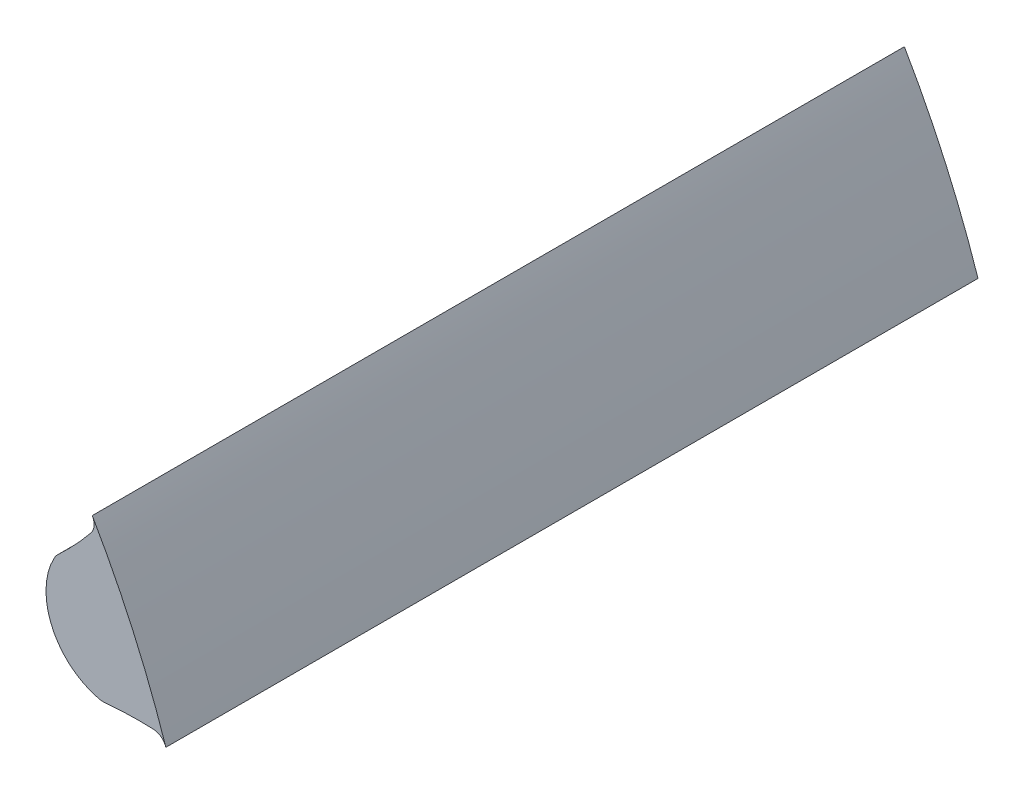
ISO-10303-21;
HEADER;
FILE_DESCRIPTION(('STEP AP214'),'2;1');
FILE_NAME('part.step','',(''),(''),'','','');
FILE_SCHEMA(('AUTOMOTIVE_DESIGN { 1 0 10303 214 1 1 1 1 }'));
ENDSEC;
DATA;
#1=APPLICATION_CONTEXT('core data for automotive mechanical design processes');
#2=APPLICATION_PROTOCOL_DEFINITION('international standard','automotive_design',2000,#1);
#3=PRODUCT_CONTEXT('',#1,'mechanical');
#4=PRODUCT('Part','Part','',(#3));
#5=PRODUCT_RELATED_PRODUCT_CATEGORY('part','',(#4));
#6=PRODUCT_DEFINITION_FORMATION('','',#4);
#7=PRODUCT_DEFINITION_CONTEXT('part definition',#1,'design');
#8=PRODUCT_DEFINITION('design','',#6,#7);
#9=PRODUCT_DEFINITION_SHAPE('','',#8);
#10=(LENGTH_UNIT() NAMED_UNIT(*) SI_UNIT(.MILLI.,.METRE.));
#11=(NAMED_UNIT(*) PLANE_ANGLE_UNIT() SI_UNIT($,.RADIAN.));
#12=(NAMED_UNIT(*) SI_UNIT($,.STERADIAN.) SOLID_ANGLE_UNIT());
#13=UNCERTAINTY_MEASURE_WITH_UNIT(LENGTH_MEASURE(1.E-05),#10,'distance_accuracy_value','');
#14=(GEOMETRIC_REPRESENTATION_CONTEXT(3) GLOBAL_UNCERTAINTY_ASSIGNED_CONTEXT((#13)) GLOBAL_UNIT_ASSIGNED_CONTEXT((#10,
#11,#12)) REPRESENTATION_CONTEXT('',''));
#15=CARTESIAN_POINT('',(0.,0.,0.));
#16=DIRECTION('',(0.,0.,1.));
#17=DIRECTION('',(1.,0.,0.));
#18=AXIS2_PLACEMENT_3D('',#15,#16,#17);
#19=CARTESIAN_POINT('',(18.0553168239476,-11.3784506297336,30.));
#20=DIRECTION('',(0.,0.,-1.));
#21=DIRECTION('',(-1.,0.,0.));
#22=AXIS2_PLACEMENT_3D('',#19,#20,#21);
#23=CYLINDRICAL_SURFACE('',#22,32.4479616874707);
#24=CARTESIAN_POINT('',(18.0553168239476,-11.3784506297336,0.));
#25=DIRECTION('',(0.,0.,1.));
#26=DIRECTION('',(-1.,0.,0.));
#27=AXIS2_PLACEMENT_3D('',#24,#25,#26);
#28=CIRCLE('',#27,32.4479616874707);
#29=CARTESIAN_POINT('',(48.858588388956,-1.17900561718941,0.));
#30=VERTEX_POINT('',#29);
#31=CARTESIAN_POINT('',(46.1391025317243,4.87489357972815,0.));
#32=VERTEX_POINT('',#31);
#33=EDGE_CURVE('E130',#30,#32,#28,.T.);
#34=ORIENTED_EDGE('',*,*,#33,.T.);
#35=DIRECTION('',(0.,0.,-1.));
#36=VECTOR('',#35,1.);
#37=CARTESIAN_POINT('',(46.1391025317243,4.87489357972815,30.));
#38=LINE('',#37,#36);
#39=CARTESIAN_POINT('',(46.1391025317243,4.87489357972815,30.));
#40=VERTEX_POINT('',#39);
#41=EDGE_CURVE('E11',#40,#32,#38,.T.);
#42=ORIENTED_EDGE('',*,*,#41,.F.);
#43=CARTESIAN_POINT('',(18.0553168239476,-11.3784506297336,30.));
#44=DIRECTION('',(0.,0.,1.));
#45=DIRECTION('',(-1.,0.,0.));
#46=AXIS2_PLACEMENT_3D('',#43,#44,#45);
#47=CIRCLE('',#46,32.4479616874707);
#48=CARTESIAN_POINT('',(48.858588388956,-1.17900561718941,30.));
#49=VERTEX_POINT('',#48);
#50=EDGE_CURVE('E144',#49,#40,#47,.T.);
#51=ORIENTED_EDGE('',*,*,#50,.F.);
#52=DIRECTION('',(0.,0.,-1.));
#53=VECTOR('',#52,1.);
#54=CARTESIAN_POINT('',(48.858588388956,-1.17900561718941,30.));
#55=LINE('',#54,#53);
#56=EDGE_CURVE('E126',#49,#30,#55,.T.);
#57=ORIENTED_EDGE('',*,*,#56,.T.);
#58=EDGE_LOOP('',(#34,#42,#51,#57));
#59=FACE_BOUND('',#58,.T.);
#60=ADVANCED_FACE('F34',(#59),#23,.T.);
#61=CARTESIAN_POINT('',(45.6994118204521,4.62042487845079,30.));
#62=DIRECTION('',(0.,0.,-1.));
#63=DIRECTION('',(-1.,0.,0.));
#64=AXIS2_PLACEMENT_3D('',#61,#62,#63);
#65=CYLINDRICAL_SURFACE('',#64,0.508017953923686);
#66=CARTESIAN_POINT('',(45.6994118204521,4.62042487845079,0.));
#67=DIRECTION('',(0.,0.,-1.));
#68=DIRECTION('',(1.,0.,0.));
#69=AXIS2_PLACEMENT_3D('',#66,#67,#68);
#70=CIRCLE('',#69,0.508017953923686);
#71=CARTESIAN_POINT('',(46.0933213564923,4.29961727423075,0.));
#72=VERTEX_POINT('',#71);
#73=EDGE_CURVE('E133',#32,#72,#70,.T.);
#74=ORIENTED_EDGE('',*,*,#73,.T.);
#75=DIRECTION('',(0.,0.,-1.));
#76=VECTOR('',#75,1.);
#77=CARTESIAN_POINT('',(46.0933213564923,4.29961727423075,30.));
#78=LINE('',#77,#76);
#79=CARTESIAN_POINT('',(46.0933213564923,4.29961727423075,30.));
#80=VERTEX_POINT('',#79);
#81=EDGE_CURVE('E42',#80,#72,#78,.T.);
#82=ORIENTED_EDGE('',*,*,#81,.F.);
#83=CARTESIAN_POINT('',(45.6994118204521,4.62042487845079,30.));
#84=DIRECTION('',(0.,0.,-1.));
#85=DIRECTION('',(1.,0.,0.));
#86=AXIS2_PLACEMENT_3D('',#83,#84,#85);
#87=CIRCLE('',#86,0.508017953923686);
#88=EDGE_CURVE('E93',#40,#80,#87,.T.);
#89=ORIENTED_EDGE('',*,*,#88,.F.);
#90=ORIENTED_EDGE('',*,*,#41,.T.);
#91=EDGE_LOOP('',(#74,#82,#89,#90));
#92=FACE_BOUND('',#91,.T.);
#93=ADVANCED_FACE('F179',(#92),#65,.F.);
#94=CARTESIAN_POINT('',(36.0491703666738,12.4801785778839,30.));
#95=DIRECTION('',(0.,0.,-1.));
#96=DIRECTION('',(-1.,0.,0.));
#97=AXIS2_PLACEMENT_3D('',#94,#95,#96);
#98=CYLINDRICAL_SURFACE('',#97,12.9540168422424);
#99=CARTESIAN_POINT('',(36.0491703666738,12.4801785778839,0.));
#100=DIRECTION('',(0.,0.,-1.));
#101=DIRECTION('',(1.,0.,0.));
#102=AXIS2_PLACEMENT_3D('',#99,#100,#101);
#103=CIRCLE('',#102,12.9540168422424);
#104=CARTESIAN_POINT('',(44.8820610129057,3.00459969420564,0.));
#105=VERTEX_POINT('',#104);
#106=EDGE_CURVE('E135',#72,#105,#103,.T.);
#107=ORIENTED_EDGE('',*,*,#106,.T.);
#108=DIRECTION('',(0.,0.,-1.));
#109=VECTOR('',#108,1.);
#110=CARTESIAN_POINT('',(44.8820610129057,3.00459969420564,30.));
#111=LINE('',#110,#109);
#112=CARTESIAN_POINT('',(44.8820610129057,3.00459969420564,30.));
#113=VERTEX_POINT('',#112);
#114=EDGE_CURVE('E151',#113,#105,#111,.T.);
#115=ORIENTED_EDGE('',*,*,#114,.F.);
#116=CARTESIAN_POINT('',(36.0491703666738,12.4801785778839,30.));
#117=DIRECTION('',(0.,0.,-1.));
#118=DIRECTION('',(1.,0.,0.));
#119=AXIS2_PLACEMENT_3D('',#116,#117,#118);
#120=CIRCLE('',#119,12.9540168422424);
#121=EDGE_CURVE('E159',#80,#113,#120,.T.);
#122=ORIENTED_EDGE('',*,*,#121,.F.);
#123=ORIENTED_EDGE('',*,*,#81,.T.);
#124=EDGE_LOOP('',(#107,#115,#122,#123));
#125=FACE_BOUND('',#124,.T.);
#126=ADVANCED_FACE('F157',(#125),#98,.F.);
#127=CARTESIAN_POINT('',(45.4016420903725,2.44721337939481,30.));
#128=DIRECTION('',(0.,0.,-1.));
#129=DIRECTION('',(-1.,0.,0.));
#130=AXIS2_PLACEMENT_3D('',#127,#128,#129);
#131=CYLINDRICAL_SURFACE('',#130,0.762000000000009);
#132=CARTESIAN_POINT('',(45.4016420903725,2.44721337939481,0.));
#133=DIRECTION('',(0.,0.,1.));
#134=DIRECTION('',(1.,0.,0.));
#135=AXIS2_PLACEMENT_3D('',#132,#133,#134);
#136=CIRCLE('',#135,0.762000000000009);
#137=CARTESIAN_POINT('',(44.7292645724628,2.80575552951059,0.));
#138=VERTEX_POINT('',#137);
#139=EDGE_CURVE('E137',#105,#138,#136,.T.);
#140=ORIENTED_EDGE('',*,*,#139,.T.);
#141=DIRECTION('',(0.,0.,-1.));
#142=VECTOR('',#141,1.);
#143=CARTESIAN_POINT('',(44.7292645724628,2.80575552951059,30.));
#144=LINE('',#143,#142);
#145=CARTESIAN_POINT('',(44.7292645724628,2.80575552951059,30.));
#146=VERTEX_POINT('',#145);
#147=EDGE_CURVE('E148',#146,#138,#144,.T.);
#148=ORIENTED_EDGE('',*,*,#147,.F.);
#149=CARTESIAN_POINT('',(45.4016420903725,2.44721337939481,30.));
#150=DIRECTION('',(0.,0.,1.));
#151=DIRECTION('',(1.,0.,0.));
#152=AXIS2_PLACEMENT_3D('',#149,#150,#151);
#153=CIRCLE('',#152,0.762000000000009);
#154=EDGE_CURVE('E171',#113,#146,#153,.T.);
#155=ORIENTED_EDGE('',*,*,#154,.F.);
#156=ORIENTED_EDGE('',*,*,#114,.T.);
#157=EDGE_LOOP('',(#140,#148,#155,#156));
#158=FACE_BOUND('',#157,.T.);
#159=ADVANCED_FACE('F167',(#158),#131,.T.);
#160=CARTESIAN_POINT('',(46.970522965495,1.61061502912464,30.));
#161=DIRECTION('',(0.,0.,-1.));
#162=DIRECTION('',(-1.,0.,0.));
#163=AXIS2_PLACEMENT_3D('',#160,#161,#162);
#164=CYLINDRICAL_SURFACE('',#163,2.54000000000002);
#165=CARTESIAN_POINT('',(46.970522965495,1.61061502912464,0.));
#166=DIRECTION('',(0.,0.,1.));
#167=DIRECTION('',(1.,0.,0.));
#168=AXIS2_PLACEMENT_3D('',#165,#166,#167);
#169=CIRCLE('',#168,2.54000000000002);
#170=CARTESIAN_POINT('',(46.3753719466105,-0.858675408373721,0.));
#171=VERTEX_POINT('',#170);
#172=EDGE_CURVE('E139',#138,#171,#169,.T.);
#173=ORIENTED_EDGE('',*,*,#172,.T.);
#174=DIRECTION('',(0.,0.,-1.));
#175=VECTOR('',#174,1.);
#176=CARTESIAN_POINT('',(46.3753719466105,-0.858675408373721,30.));
#177=LINE('',#176,#175);
#178=CARTESIAN_POINT('',(46.3753719466105,-0.858675408373721,30.));
#179=VERTEX_POINT('',#178);
#180=EDGE_CURVE('E121',#179,#171,#177,.T.);
#181=ORIENTED_EDGE('',*,*,#180,.F.);
#182=CARTESIAN_POINT('',(46.970522965495,1.61061502912464,30.));
#183=DIRECTION('',(0.,0.,1.));
#184=DIRECTION('',(1.,0.,0.));
#185=AXIS2_PLACEMENT_3D('',#182,#183,#184);
#186=CIRCLE('',#185,2.54000000000002);
#187=EDGE_CURVE('E112',#146,#179,#186,.T.);
#188=ORIENTED_EDGE('',*,*,#187,.F.);
#189=ORIENTED_EDGE('',*,*,#147,.T.);
#190=EDGE_LOOP('',(#173,#181,#188,#189));
#191=FACE_BOUND('',#190,.T.);
#192=ADVANCED_FACE('F170',(#191),#164,.T.);
#193=CARTESIAN_POINT('',(46.5539172522759,-0.117888277124249,30.));
#194=DIRECTION('',(0.,0.,-1.));
#195=DIRECTION('',(-1.,0.,0.));
#196=AXIS2_PLACEMENT_3D('',#193,#194,#195);
#197=CYLINDRICAL_SURFACE('',#196,0.761999999999973);
#198=CARTESIAN_POINT('',(46.5539172522759,-0.117888277124249,0.));
#199=DIRECTION('',(0.,0.,1.));
#200=DIRECTION('',(1.,0.,0.));
#201=AXIS2_PLACEMENT_3D('',#198,#199,#200);
#202=CIRCLE('',#201,0.761999999999973);
#203=CARTESIAN_POINT('',(46.6255067072381,-0.876517929812682,0.));
#204=VERTEX_POINT('',#203);
#205=EDGE_CURVE('E120',#171,#204,#202,.T.);
#206=ORIENTED_EDGE('',*,*,#205,.T.);
#207=DIRECTION('',(0.,0.,-1.));
#208=VECTOR('',#207,1.);
#209=CARTESIAN_POINT('',(46.6255067072381,-0.876517929812682,30.));
#210=LINE('',#209,#208);
#211=CARTESIAN_POINT('',(46.6255067072381,-0.876517929812682,30.));
#212=VERTEX_POINT('',#211);
#213=EDGE_CURVE('E117',#212,#204,#210,.T.);
#214=ORIENTED_EDGE('',*,*,#213,.F.);
#215=CARTESIAN_POINT('',(46.5539172522759,-0.117888277124249,30.));
#216=DIRECTION('',(0.,0.,1.));
#217=DIRECTION('',(1.,0.,0.));
#218=AXIS2_PLACEMENT_3D('',#215,#216,#217);
#219=CIRCLE('',#218,0.761999999999973);
#220=EDGE_CURVE('E106',#179,#212,#219,.T.);
#221=ORIENTED_EDGE('',*,*,#220,.F.);
#222=ORIENTED_EDGE('',*,*,#180,.T.);
#223=EDGE_LOOP('',(#206,#214,#221,#222));
#224=FACE_BOUND('',#223,.T.);
#225=ADVANCED_FACE('F118',(#224),#197,.T.);
#226=CARTESIAN_POINT('',(47.8425278736006,-13.7732389018158,30.));
#227=DIRECTION('',(0.,0.,-1.));
#228=DIRECTION('',(-1.,0.,0.));
#229=AXIS2_PLACEMENT_3D('',#226,#227,#228);
#230=CYLINDRICAL_SURFACE('',#229,12.9540168422416);
#231=CARTESIAN_POINT('',(47.8425278736006,-13.7732389018158,0.));
#232=DIRECTION('',(0.,0.,-1.));
#233=DIRECTION('',(1.,0.,0.));
#234=AXIS2_PLACEMENT_3D('',#231,#232,#233);
#235=CIRCLE('',#234,12.9540168422416);
#236=CARTESIAN_POINT('',(48.3981214967595,-0.831142159982023,0.));
#237=VERTEX_POINT('',#236);
#238=EDGE_CURVE('E79',#204,#237,#235,.T.);
#239=ORIENTED_EDGE('',*,*,#238,.T.);
#240=DIRECTION('',(0.,0.,-1.));
#241=VECTOR('',#240,1.);
#242=CARTESIAN_POINT('',(48.3981214967595,-0.831142159982023,30.));
#243=LINE('',#242,#241);
#244=CARTESIAN_POINT('',(48.3981214967595,-0.831142159982023,30.));
#245=VERTEX_POINT('',#244);
#246=EDGE_CURVE('E122',#245,#237,#243,.T.);
#247=ORIENTED_EDGE('',*,*,#246,.F.);
#248=CARTESIAN_POINT('',(47.8425278736006,-13.7732389018158,30.));
#249=DIRECTION('',(0.,0.,-1.));
#250=DIRECTION('',(1.,0.,0.));
#251=AXIS2_PLACEMENT_3D('',#248,#249,#250);
#252=CIRCLE('',#251,12.9540168422416);
#253=EDGE_CURVE('E110',#212,#245,#252,.T.);
#254=ORIENTED_EDGE('',*,*,#253,.F.);
#255=ORIENTED_EDGE('',*,*,#213,.T.);
#256=EDGE_LOOP('',(#239,#247,#254,#255));
#257=FACE_BOUND('',#256,.T.);
#258=ADVANCED_FACE('F124',(#257),#230,.F.);
#259=CARTESIAN_POINT('',(48.3763203455782,-1.33869210955949,30.));
#260=DIRECTION('',(0.,0.,-1.));
#261=DIRECTION('',(-1.,0.,0.));
#262=AXIS2_PLACEMENT_3D('',#259,#260,#261);
#263=CYLINDRICAL_SURFACE('',#262,0.508017953923802);
#264=CARTESIAN_POINT('',(48.3763203455782,-1.33869210955949,0.));
#265=DIRECTION('',(0.,0.,-1.));
#266=DIRECTION('',(1.,0.,0.));
#267=AXIS2_PLACEMENT_3D('',#264,#265,#266);
#268=CIRCLE('',#267,0.508017953923802);
#269=EDGE_CURVE('E85',#237,#30,#268,.T.);
#270=ORIENTED_EDGE('',*,*,#269,.T.);
#271=ORIENTED_EDGE('',*,*,#56,.F.);
#272=CARTESIAN_POINT('',(48.3763203455782,-1.33869210955949,30.));
#273=DIRECTION('',(0.,0.,-1.));
#274=DIRECTION('',(1.,0.,0.));
#275=AXIS2_PLACEMENT_3D('',#272,#273,#274);
#276=CIRCLE('',#275,0.508017953923802);
#277=EDGE_CURVE('E50',#245,#49,#276,.T.);
#278=ORIENTED_EDGE('',*,*,#277,.F.);
#279=ORIENTED_EDGE('',*,*,#246,.T.);
#280=EDGE_LOOP('',(#270,#271,#278,#279));
#281=FACE_BOUND('',#280,.T.);
#282=ADVANCED_FACE('F195',(#281),#263,.F.);
#283=CARTESIAN_POINT('',(33.2158185847629,-6.35857136964655,30.));
#284=DIRECTION('',(0.,0.,-1.));
#285=DIRECTION('',(-1.,0.,0.));
#286=AXIS2_PLACEMENT_3D('',#283,#284,#285);
#287=PLANE('',#286);
#288=ORIENTED_EDGE('',*,*,#50,.T.);
#289=ORIENTED_EDGE('',*,*,#88,.T.);
#290=ORIENTED_EDGE('',*,*,#121,.T.);
#291=ORIENTED_EDGE('',*,*,#154,.T.);
#292=ORIENTED_EDGE('',*,*,#187,.T.);
#293=ORIENTED_EDGE('',*,*,#220,.T.);
#294=ORIENTED_EDGE('',*,*,#253,.T.);
#295=ORIENTED_EDGE('',*,*,#277,.T.);
#296=EDGE_LOOP('',(#288,#289,#290,#291,#292,#293,#294,#295));
#297=FACE_BOUND('',#296,.T.);
#298=ADVANCED_FACE('F108',(#297),#287,.F.);
#299=CARTESIAN_POINT('',(33.2158185847629,-6.35857136964655,0.));
#300=DIRECTION('',(0.,0.,-1.));
#301=DIRECTION('',(-1.,0.,0.));
#302=AXIS2_PLACEMENT_3D('',#299,#300,#301);
#303=PLANE('',#302);
#304=ORIENTED_EDGE('',*,*,#33,.F.);
#305=ORIENTED_EDGE('',*,*,#269,.F.);
#306=ORIENTED_EDGE('',*,*,#238,.F.);
#307=ORIENTED_EDGE('',*,*,#205,.F.);
#308=ORIENTED_EDGE('',*,*,#172,.F.);
#309=ORIENTED_EDGE('',*,*,#139,.F.);
#310=ORIENTED_EDGE('',*,*,#106,.F.);
#311=ORIENTED_EDGE('',*,*,#73,.F.);
#312=EDGE_LOOP('',(#304,#305,#306,#307,#308,#309,#310,#311));
#313=FACE_BOUND('',#312,.T.);
#314=ADVANCED_FACE('F163',(#313),#303,.T.);
#315=CLOSED_SHELL('',(#60,#93,#126,#159,#192,#225,#258,#282,#298,#314));
#316=MANIFOLD_SOLID_BREP('B2',#315);
#317=ADVANCED_BREP_SHAPE_REPRESENTATION('',(#18,#316),#14);
#318=SHAPE_DEFINITION_REPRESENTATION(#9,#317);
ENDSEC;
END-ISO-10303-21;
